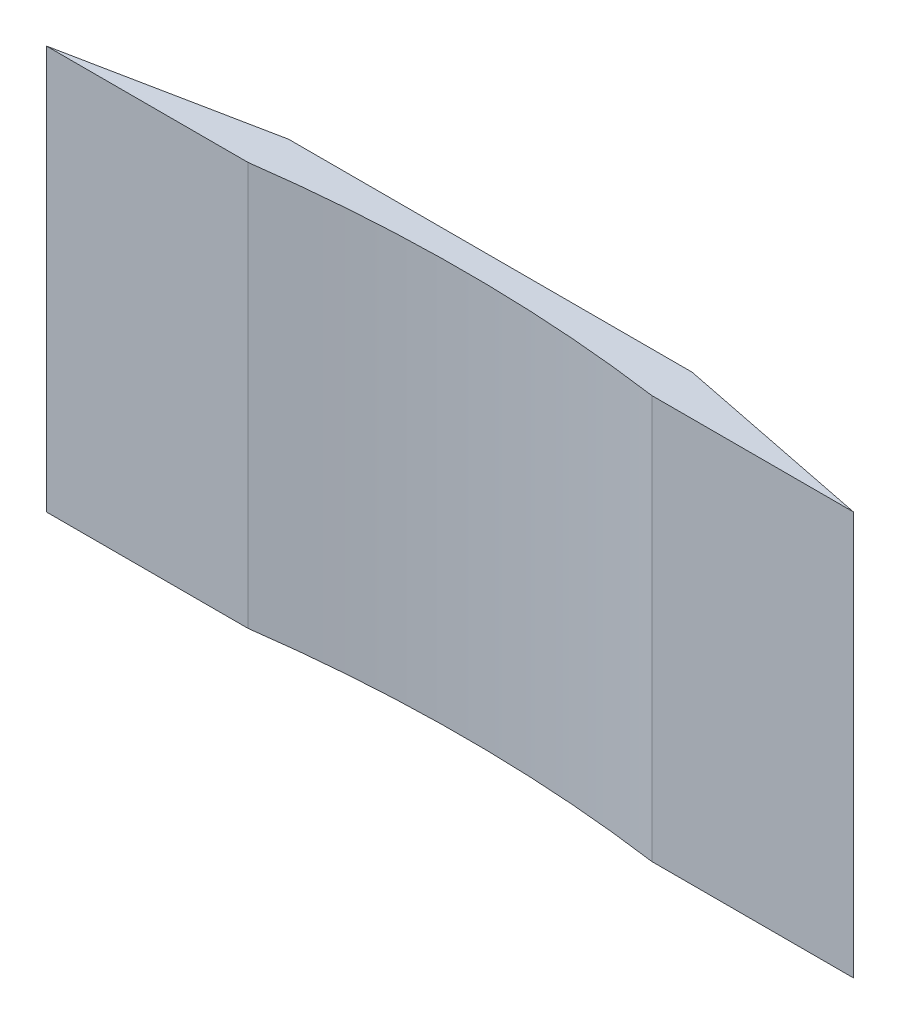
ISO-10303-21;
HEADER;
FILE_DESCRIPTION(('STEP AP214'),'2;1');
FILE_NAME('part.step','',(''),(''),'','','');
FILE_SCHEMA(('AUTOMOTIVE_DESIGN { 1 0 10303 214 1 1 1 1 }'));
ENDSEC;
DATA;
#1=APPLICATION_CONTEXT('core data for automotive mechanical design processes');
#2=APPLICATION_PROTOCOL_DEFINITION('international standard','automotive_design',2000,#1);
#3=PRODUCT_CONTEXT('',#1,'mechanical');
#4=PRODUCT('Part','Part','',(#3));
#5=PRODUCT_RELATED_PRODUCT_CATEGORY('part','',(#4));
#6=PRODUCT_DEFINITION_FORMATION('','',#4);
#7=PRODUCT_DEFINITION_CONTEXT('part definition',#1,'design');
#8=PRODUCT_DEFINITION('design','',#6,#7);
#9=PRODUCT_DEFINITION_SHAPE('','',#8);
#10=(LENGTH_UNIT() NAMED_UNIT(*) SI_UNIT(.MILLI.,.METRE.));
#11=(NAMED_UNIT(*) PLANE_ANGLE_UNIT() SI_UNIT($,.RADIAN.));
#12=(NAMED_UNIT(*) SI_UNIT($,.STERADIAN.) SOLID_ANGLE_UNIT());
#13=UNCERTAINTY_MEASURE_WITH_UNIT(LENGTH_MEASURE(1.E-05),#10,'distance_accuracy_value','');
#14=(GEOMETRIC_REPRESENTATION_CONTEXT(3) GLOBAL_UNCERTAINTY_ASSIGNED_CONTEXT((#13)) GLOBAL_UNIT_ASSIGNED_CONTEXT((#10,
#11,#12)) REPRESENTATION_CONTEXT('',''));
#15=CARTESIAN_POINT('',(0.,0.,0.));
#16=DIRECTION('',(0.,0.,1.));
#17=DIRECTION('',(1.,0.,0.));
#18=AXIS2_PLACEMENT_3D('',#15,#16,#17);
#19=CARTESIAN_POINT('',(-53.83502170767,200.,13.2850940665702));
#20=DIRECTION('',(0.196116135138184,0.,0.98058067569092));
#21=DIRECTION('',(0.98058067569092,0.,-0.196116135138184));
#22=AXIS2_PLACEMENT_3D('',#19,#20,#21);
#23=PLANE('',#22);
#24=DIRECTION('',(-0.98058067569092,0.,0.196116135138184));
#25=VECTOR('',#24,1.);
#26=CARTESIAN_POINT('',(-53.83502170767,0.,13.2850940665702));
#27=LINE('',#26,#25);
#28=CARTESIAN_POINT('',(-53.83502170767,0.,13.2850940665702));
#29=VERTEX_POINT('',#28);
#30=CARTESIAN_POINT('',(-153.83502170767,0.,33.2850940665702));
#31=VERTEX_POINT('',#30);
#32=EDGE_CURVE('E121',#29,#31,#27,.T.);
#33=ORIENTED_EDGE('',*,*,#32,.T.);
#34=DIRECTION('',(0.,-1.,0.));
#35=VECTOR('',#34,1.);
#36=CARTESIAN_POINT('',(-153.83502170767,200.,33.2850940665702));
#37=LINE('',#36,#35);
#38=CARTESIAN_POINT('',(-153.83502170767,200.,33.2850940665702));
#39=VERTEX_POINT('',#38);
#40=EDGE_CURVE('E11',#39,#31,#37,.T.);
#41=ORIENTED_EDGE('',*,*,#40,.F.);
#42=DIRECTION('',(-0.98058067569092,0.,0.196116135138184));
#43=VECTOR('',#42,1.);
#44=CARTESIAN_POINT('',(-53.83502170767,200.,13.2850940665702));
#45=LINE('',#44,#43);
#46=CARTESIAN_POINT('',(-53.83502170767,200.,13.2850940665702));
#47=VERTEX_POINT('',#46);
#48=EDGE_CURVE('E131',#47,#39,#45,.T.);
#49=ORIENTED_EDGE('',*,*,#48,.F.);
#50=DIRECTION('',(0.,-1.,0.));
#51=VECTOR('',#50,1.);
#52=CARTESIAN_POINT('',(-53.83502170767,200.,13.2850940665702));
#53=LINE('',#52,#51);
#54=EDGE_CURVE('E117',#47,#29,#53,.T.);
#55=ORIENTED_EDGE('',*,*,#54,.T.);
#56=EDGE_LOOP('',(#33,#41,#49,#55));
#57=FACE_BOUND('',#56,.T.);
#58=ADVANCED_FACE('F37',(#57),#23,.F.);
#59=CARTESIAN_POINT('',(-153.83502170767,200.,33.2850940665702));
#60=DIRECTION('',(0.,0.,-1.));
#61=DIRECTION('',(-1.,0.,0.));
#62=AXIS2_PLACEMENT_3D('',#59,#60,#61);
#63=PLANE('',#62);
#64=DIRECTION('',(1.,0.,0.));
#65=VECTOR('',#64,1.);
#66=CARTESIAN_POINT('',(-153.83502170767,0.,33.2850940665702));
#67=LINE('',#66,#65);
#68=CARTESIAN_POINT('',(-53.8350217076701,0.,33.2850940665702));
#69=VERTEX_POINT('',#68);
#70=EDGE_CURVE('E124',#31,#69,#67,.T.);
#71=ORIENTED_EDGE('',*,*,#70,.T.);
#72=DIRECTION('',(0.,-1.,0.));
#73=VECTOR('',#72,1.);
#74=CARTESIAN_POINT('',(-53.8350217076701,200.,33.2850940665702));
#75=LINE('',#74,#73);
#76=CARTESIAN_POINT('',(-53.8350217076701,200.,33.2850940665702));
#77=VERTEX_POINT('',#76);
#78=EDGE_CURVE('E45',#77,#69,#75,.T.);
#79=ORIENTED_EDGE('',*,*,#78,.F.);
#80=DIRECTION('',(1.,0.,0.));
#81=VECTOR('',#80,1.);
#82=CARTESIAN_POINT('',(-153.83502170767,200.,33.2850940665702));
#83=LINE('',#82,#81);
#84=EDGE_CURVE('E90',#39,#77,#83,.T.);
#85=ORIENTED_EDGE('',*,*,#84,.F.);
#86=ORIENTED_EDGE('',*,*,#40,.T.);
#87=EDGE_LOOP('',(#71,#79,#85,#86));
#88=FACE_BOUND('',#87,.T.);
#89=ADVANCED_FACE('F155',(#88),#63,.F.);
#90=CARTESIAN_POINT('',(46.16497829233,200.,755.029509457544));
#91=DIRECTION('',(0.,-1.,0.));
#92=DIRECTION('',(0.,0.,-1.));
#93=AXIS2_PLACEMENT_3D('',#90,#91,#92);
#94=CYLINDRICAL_SURFACE('',#93,728.639143299383);
#95=CARTESIAN_POINT('',(46.16497829233,0.,755.029509457544));
#96=DIRECTION('',(0.,-1.,0.));
#97=DIRECTION('',(0.,0.,-1.));
#98=AXIS2_PLACEMENT_3D('',#95,#96,#97);
#99=CIRCLE('',#98,728.639143299383);
#100=CARTESIAN_POINT('',(146.16497829233,0.,33.2850940665702));
#101=VERTEX_POINT('',#100);
#102=EDGE_CURVE('E126',#69,#101,#99,.T.);
#103=ORIENTED_EDGE('',*,*,#102,.T.);
#104=DIRECTION('',(0.,-1.,0.));
#105=VECTOR('',#104,1.);
#106=CARTESIAN_POINT('',(146.16497829233,200.,33.2850940665702));
#107=LINE('',#106,#105);
#108=CARTESIAN_POINT('',(146.16497829233,200.,33.2850940665702));
#109=VERTEX_POINT('',#108);
#110=EDGE_CURVE('E112',#109,#101,#107,.T.);
#111=ORIENTED_EDGE('',*,*,#110,.F.);
#112=CARTESIAN_POINT('',(46.16497829233,200.,755.029509457544));
#113=DIRECTION('',(0.,-1.,0.));
#114=DIRECTION('',(0.,0.,-1.));
#115=AXIS2_PLACEMENT_3D('',#112,#113,#114);
#116=CIRCLE('',#115,728.639143299383);
#117=EDGE_CURVE('E103',#77,#109,#116,.T.);
#118=ORIENTED_EDGE('',*,*,#117,.F.);
#119=ORIENTED_EDGE('',*,*,#78,.T.);
#120=EDGE_LOOP('',(#103,#111,#118,#119));
#121=FACE_BOUND('',#120,.T.);
#122=ADVANCED_FACE('F137',(#121),#94,.F.);
#123=CARTESIAN_POINT('',(146.16497829233,200.,33.2850940665702));
#124=DIRECTION('',(0.,0.,-1.));
#125=DIRECTION('',(-1.,0.,0.));
#126=AXIS2_PLACEMENT_3D('',#123,#124,#125);
#127=PLANE('',#126);
#128=DIRECTION('',(1.,0.,0.));
#129=VECTOR('',#128,1.);
#130=CARTESIAN_POINT('',(146.16497829233,0.,33.2850940665702));
#131=LINE('',#130,#129);
#132=CARTESIAN_POINT('',(246.16497829233,0.,33.2850940665702));
#133=VERTEX_POINT('',#132);
#134=EDGE_CURVE('E111',#101,#133,#131,.T.);
#135=ORIENTED_EDGE('',*,*,#134,.T.);
#136=DIRECTION('',(0.,-1.,0.));
#137=VECTOR('',#136,1.);
#138=CARTESIAN_POINT('',(246.16497829233,200.,33.2850940665702));
#139=LINE('',#138,#137);
#140=CARTESIAN_POINT('',(246.16497829233,200.,33.2850940665702));
#141=VERTEX_POINT('',#140);
#142=EDGE_CURVE('E108',#141,#133,#139,.T.);
#143=ORIENTED_EDGE('',*,*,#142,.F.);
#144=DIRECTION('',(1.,0.,0.));
#145=VECTOR('',#144,1.);
#146=CARTESIAN_POINT('',(146.16497829233,200.,33.2850940665702));
#147=LINE('',#146,#145);
#148=EDGE_CURVE('E97',#109,#141,#147,.T.);
#149=ORIENTED_EDGE('',*,*,#148,.F.);
#150=ORIENTED_EDGE('',*,*,#110,.T.);
#151=EDGE_LOOP('',(#135,#143,#149,#150));
#152=FACE_BOUND('',#151,.T.);
#153=ADVANCED_FACE('F109',(#152),#127,.F.);
#154=CARTESIAN_POINT('',(246.16497829233,200.,33.2850940665702));
#155=DIRECTION('',(-0.196116135138184,0.,0.98058067569092));
#156=DIRECTION('',(0.98058067569092,0.,0.196116135138184));
#157=AXIS2_PLACEMENT_3D('',#154,#155,#156);
#158=PLANE('',#157);
#159=DIRECTION('',(-0.98058067569092,0.,-0.196116135138184));
#160=VECTOR('',#159,1.);
#161=CARTESIAN_POINT('',(246.16497829233,0.,33.2850940665702));
#162=LINE('',#161,#160);
#163=CARTESIAN_POINT('',(146.16497829233,0.,13.2850940665702));
#164=VERTEX_POINT('',#163);
#165=EDGE_CURVE('E76',#133,#164,#162,.T.);
#166=ORIENTED_EDGE('',*,*,#165,.T.);
#167=DIRECTION('',(0.,-1.,0.));
#168=VECTOR('',#167,1.);
#169=CARTESIAN_POINT('',(146.16497829233,200.,13.2850940665702));
#170=LINE('',#169,#168);
#171=CARTESIAN_POINT('',(146.16497829233,200.,13.2850940665702));
#172=VERTEX_POINT('',#171);
#173=EDGE_CURVE('E113',#172,#164,#170,.T.);
#174=ORIENTED_EDGE('',*,*,#173,.F.);
#175=DIRECTION('',(-0.98058067569092,0.,-0.196116135138184));
#176=VECTOR('',#175,1.);
#177=CARTESIAN_POINT('',(246.16497829233,200.,33.2850940665702));
#178=LINE('',#177,#176);
#179=EDGE_CURVE('E101',#141,#172,#178,.T.);
#180=ORIENTED_EDGE('',*,*,#179,.F.);
#181=ORIENTED_EDGE('',*,*,#142,.T.);
#182=EDGE_LOOP('',(#166,#174,#180,#181));
#183=FACE_BOUND('',#182,.T.);
#184=ADVANCED_FACE('F115',(#183),#158,.F.);
#185=CARTESIAN_POINT('',(146.16497829233,200.,13.2850940665702));
#186=DIRECTION('',(0.,0.,1.));
#187=DIRECTION('',(1.,0.,0.));
#188=AXIS2_PLACEMENT_3D('',#185,#186,#187);
#189=PLANE('',#188);
#190=DIRECTION('',(-1.,0.,0.));
#191=VECTOR('',#190,1.);
#192=CARTESIAN_POINT('',(146.16497829233,0.,13.2850940665702));
#193=LINE('',#192,#191);
#194=EDGE_CURVE('E82',#164,#29,#193,.T.);
#195=ORIENTED_EDGE('',*,*,#194,.T.);
#196=ORIENTED_EDGE('',*,*,#54,.F.);
#197=DIRECTION('',(-1.,0.,0.));
#198=VECTOR('',#197,1.);
#199=CARTESIAN_POINT('',(146.16497829233,200.,13.2850940665702));
#200=LINE('',#199,#198);
#201=EDGE_CURVE('E53',#172,#47,#200,.T.);
#202=ORIENTED_EDGE('',*,*,#201,.F.);
#203=ORIENTED_EDGE('',*,*,#173,.T.);
#204=EDGE_LOOP('',(#195,#196,#202,#203));
#205=FACE_BOUND('',#204,.T.);
#206=ADVANCED_FACE('F144',(#205),#189,.F.);
#207=CARTESIAN_POINT('',(46.16497829233,200.,755.029509457544));
#208=DIRECTION('',(0.,-1.,0.));
#209=DIRECTION('',(0.,0.,-1.));
#210=AXIS2_PLACEMENT_3D('',#207,#208,#209);
#211=PLANE('',#210);
#212=ORIENTED_EDGE('',*,*,#48,.T.);
#213=ORIENTED_EDGE('',*,*,#84,.T.);
#214=ORIENTED_EDGE('',*,*,#117,.T.);
#215=ORIENTED_EDGE('',*,*,#148,.T.);
#216=ORIENTED_EDGE('',*,*,#179,.T.);
#217=ORIENTED_EDGE('',*,*,#201,.T.);
#218=EDGE_LOOP('',(#212,#213,#214,#215,#216,#217));
#219=FACE_BOUND('',#218,.T.);
#220=ADVANCED_FACE('F99',(#219),#211,.F.);
#221=CARTESIAN_POINT('',(46.16497829233,0.,755.029509457544));
#222=DIRECTION('',(0.,-1.,0.));
#223=DIRECTION('',(0.,0.,-1.));
#224=AXIS2_PLACEMENT_3D('',#221,#222,#223);
#225=PLANE('',#224);
#226=ORIENTED_EDGE('',*,*,#32,.F.);
#227=ORIENTED_EDGE('',*,*,#194,.F.);
#228=ORIENTED_EDGE('',*,*,#165,.F.);
#229=ORIENTED_EDGE('',*,*,#134,.F.);
#230=ORIENTED_EDGE('',*,*,#102,.F.);
#231=ORIENTED_EDGE('',*,*,#70,.F.);
#232=EDGE_LOOP('',(#226,#227,#228,#229,#230,#231));
#233=FACE_BOUND('',#232,.T.);
#234=ADVANCED_FACE('F140',(#233),#225,.T.);
#235=CLOSED_SHELL('',(#58,#89,#122,#153,#184,#206,#220,#234));
#236=MANIFOLD_SOLID_BREP('B2',#235);
#237=ADVANCED_BREP_SHAPE_REPRESENTATION('',(#18,#236),#14);
#238=SHAPE_DEFINITION_REPRESENTATION(#9,#237);
ENDSEC;
END-ISO-10303-21;
